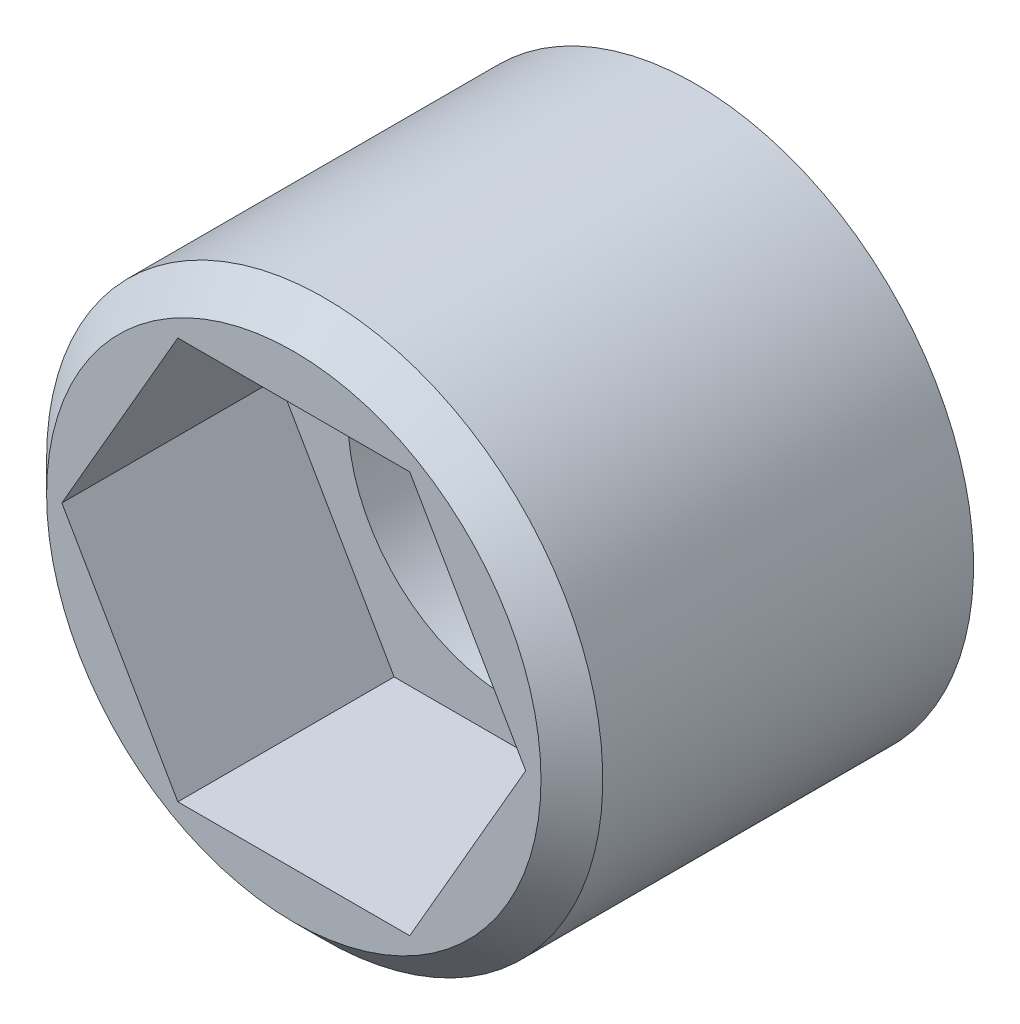
ISO-10303-21;
HEADER;
FILE_DESCRIPTION(('STEP AP214'),'2;1');
FILE_NAME('part.step','',(''),(''),'','','');
FILE_SCHEMA(('AUTOMOTIVE_DESIGN { 1 0 10303 214 1 1 1 1 }'));
ENDSEC;
DATA;
#1=APPLICATION_CONTEXT('core data for automotive mechanical design processes');
#2=APPLICATION_PROTOCOL_DEFINITION('international standard','automotive_design',2000,#1);
#3=PRODUCT_CONTEXT('',#1,'mechanical');
#4=PRODUCT('Part','Part','',(#3));
#5=PRODUCT_RELATED_PRODUCT_CATEGORY('part','',(#4));
#6=PRODUCT_DEFINITION_FORMATION('','',#4);
#7=PRODUCT_DEFINITION_CONTEXT('part definition',#1,'design');
#8=PRODUCT_DEFINITION('design','',#6,#7);
#9=PRODUCT_DEFINITION_SHAPE('','',#8);
#10=(LENGTH_UNIT() NAMED_UNIT(*) SI_UNIT(.MILLI.,.METRE.));
#11=(NAMED_UNIT(*) PLANE_ANGLE_UNIT() SI_UNIT($,.RADIAN.));
#12=(NAMED_UNIT(*) SI_UNIT($,.STERADIAN.) SOLID_ANGLE_UNIT());
#13=UNCERTAINTY_MEASURE_WITH_UNIT(LENGTH_MEASURE(1.E-05),#10,'distance_accuracy_value','');
#14=(GEOMETRIC_REPRESENTATION_CONTEXT(3) GLOBAL_UNCERTAINTY_ASSIGNED_CONTEXT((#13)) GLOBAL_UNIT_ASSIGNED_CONTEXT((#10,
#11,#12)) REPRESENTATION_CONTEXT('',''));
#15=CARTESIAN_POINT('',(0.,0.,0.));
#16=DIRECTION('',(0.,0.,1.));
#17=DIRECTION('',(1.,0.,0.));
#18=AXIS2_PLACEMENT_3D('',#15,#16,#17);
#19=CARTESIAN_POINT('',(0.,0.,13.));
#20=DIRECTION('',(0.,0.,-1.));
#21=DIRECTION('',(-1.,0.,0.));
#22=AXIS2_PLACEMENT_3D('',#19,#20,#21);
#23=CYLINDRICAL_SURFACE('',#22,5.25);
#24=CARTESIAN_POINT('',(0.,0.,0.));
#25=DIRECTION('',(0.,0.,1.));
#26=DIRECTION('',(1.,0.,0.));
#27=AXIS2_PLACEMENT_3D('',#24,#25,#26);
#28=CIRCLE('',#27,5.25);
#29=CARTESIAN_POINT('',(-5.25,0.,0.));
#30=VERTEX_POINT('',#29);
#31=EDGE_CURVE('E140',#30,#30,#28,.T.);
#32=CARTESIAN_POINT('',(0.,0.,6.));
#33=DIRECTION('',(0.,0.,1.));
#34=DIRECTION('',(1.,0.,0.));
#35=AXIS2_PLACEMENT_3D('',#32,#33,#34);
#36=CIRCLE('',#35,5.25);
#37=CARTESIAN_POINT('',(-5.25,0.,6.));
#38=VERTEX_POINT('',#37);
#39=EDGE_CURVE('E134',#38,#38,#36,.T.);
#40=CARTESIAN_POINT('',(-5.25,0.,0.));
#41=CARTESIAN_POINT('',(-5.25,0.,0.0625000000000001));
#42=CARTESIAN_POINT('',(-5.25,0.,0.125));
#43=CARTESIAN_POINT('',(-5.25,0.,0.25));
#44=CARTESIAN_POINT('',(-5.25,0.,0.3125));
#45=CARTESIAN_POINT('',(-5.25,0.,0.4375));
#46=CARTESIAN_POINT('',(-5.25,0.,0.5));
#47=CARTESIAN_POINT('',(-5.25,0.,0.625000000000001));
#48=CARTESIAN_POINT('',(-5.25,0.,0.687500000000001));
#49=CARTESIAN_POINT('',(-5.25,0.,0.812500000000001));
#50=CARTESIAN_POINT('',(-5.25,0.,0.875000000000001));
#51=CARTESIAN_POINT('',(-5.25,0.,1.));
#52=CARTESIAN_POINT('',(-5.25,0.,1.0625));
#53=CARTESIAN_POINT('',(-5.25,0.,1.1875));
#54=CARTESIAN_POINT('',(-5.25,0.,1.25));
#55=CARTESIAN_POINT('',(-5.25,0.,1.375));
#56=CARTESIAN_POINT('',(-5.25,0.,1.4375));
#57=CARTESIAN_POINT('',(-5.25,0.,1.5625));
#58=CARTESIAN_POINT('',(-5.25,0.,1.625));
#59=CARTESIAN_POINT('',(-5.25,0.,1.75));
#60=CARTESIAN_POINT('',(-5.25,0.,1.8125));
#61=CARTESIAN_POINT('',(-5.25,0.,1.9375));
#62=CARTESIAN_POINT('',(-5.25,0.,2.));
#63=CARTESIAN_POINT('',(-5.25,0.,2.125));
#64=CARTESIAN_POINT('',(-5.25,0.,2.1875));
#65=CARTESIAN_POINT('',(-5.25,0.,2.3125));
#66=CARTESIAN_POINT('',(-5.25,0.,2.375));
#67=CARTESIAN_POINT('',(-5.25,0.,2.5));
#68=CARTESIAN_POINT('',(-5.25,0.,2.5625));
#69=CARTESIAN_POINT('',(-5.25,0.,2.6875));
#70=CARTESIAN_POINT('',(-5.25,0.,2.75));
#71=CARTESIAN_POINT('',(-5.25,0.,2.875));
#72=CARTESIAN_POINT('',(-5.25,0.,2.9375));
#73=CARTESIAN_POINT('',(-5.25,0.,3.0625));
#74=CARTESIAN_POINT('',(-5.25,0.,3.125));
#75=CARTESIAN_POINT('',(-5.25,0.,3.25));
#76=CARTESIAN_POINT('',(-5.25,0.,3.3125));
#77=CARTESIAN_POINT('',(-5.25,0.,3.4375));
#78=CARTESIAN_POINT('',(-5.25,0.,3.5));
#79=CARTESIAN_POINT('',(-5.25,0.,3.625));
#80=CARTESIAN_POINT('',(-5.25,0.,3.6875));
#81=CARTESIAN_POINT('',(-5.25,0.,3.8125));
#82=CARTESIAN_POINT('',(-5.25,0.,3.875));
#83=CARTESIAN_POINT('',(-5.25,0.,4.));
#84=CARTESIAN_POINT('',(-5.25,0.,4.0625));
#85=CARTESIAN_POINT('',(-5.25,0.,4.1875));
#86=CARTESIAN_POINT('',(-5.25,0.,4.25));
#87=CARTESIAN_POINT('',(-5.25,0.,4.375));
#88=CARTESIAN_POINT('',(-5.25,0.,4.4375));
#89=CARTESIAN_POINT('',(-5.25,0.,4.5625));
#90=CARTESIAN_POINT('',(-5.25,0.,4.625));
#91=CARTESIAN_POINT('',(-5.25,0.,4.75));
#92=CARTESIAN_POINT('',(-5.25,0.,4.8125));
#93=CARTESIAN_POINT('',(-5.25,0.,4.9375));
#94=CARTESIAN_POINT('',(-5.25,0.,5.));
#95=CARTESIAN_POINT('',(-5.25,0.,5.125));
#96=CARTESIAN_POINT('',(-5.25,0.,5.1875));
#97=CARTESIAN_POINT('',(-5.25,0.,5.3125));
#98=CARTESIAN_POINT('',(-5.25,0.,5.375));
#99=CARTESIAN_POINT('',(-5.25,0.,5.5));
#100=CARTESIAN_POINT('',(-5.25,0.,5.5625));
#101=CARTESIAN_POINT('',(-5.25,0.,5.6875));
#102=CARTESIAN_POINT('',(-5.25,0.,5.75));
#103=CARTESIAN_POINT('',(-5.25,0.,5.875));
#104=CARTESIAN_POINT('',(-5.25,0.,5.9375));
#105=CARTESIAN_POINT('',(-5.25,0.,6.));
#106=B_SPLINE_CURVE_WITH_KNOTS('',3,(#40,#41,#42,#43,#44,#45,#46,#47,#48,#49,#50,#51,#52,#53,
#54,#55,#56,#57,#58,#59,#60,#61,#62,#63,#64,#65,#66,#67,#68,#69,#70,#71,#72,#73,#74,#75,#76,#77,
#78,#79,#80,#81,#82,#83,#84,#85,#86,#87,#88,#89,#90,#91,#92,#93,#94,#95,#96,#97,#98,#99,#100,
#101,#102,#103,#104,#105),.UNSPECIFIED.,.F.,.F.,(4,2,2,2,2,2,2,2,2,2,2,2,2,2,2,2,2,2,2,2,2,2,2,
2,2,2,2,2,2,2,2,2,4),(0.,0.1875,0.375,0.5625,0.750000000000001,0.937500000000001,1.125,1.3125,
1.5,1.6875,1.875,2.0625,2.25,2.4375,2.625,2.8125,3.,3.1875,3.375,3.5625,3.75,3.9375,4.125,
4.3125,4.5,4.6875,4.875,5.0625,5.25,5.4375,5.625,5.8125,6.),.UNSPECIFIED.);
#107=EDGE_CURVE('BSEAM32',#30,#38,#106,.T.);
#108=ORIENTED_EDGE('',*,*,#31,.F.);
#109=ORIENTED_EDGE('',*,*,#39,.T.);
#110=ORIENTED_EDGE('',*,*,#107,.T.);
#111=ORIENTED_EDGE('',*,*,#107,.F.);
#112=EDGE_LOOP('',(#108,#110,#109,#111));
#113=FACE_BOUND('',#112,.T.);
#114=ADVANCED_FACE('F32',(#113),#23,.F.);
#115=CARTESIAN_POINT('',(0.,0.,13.));
#116=DIRECTION('',(0.,0.,1.));
#117=DIRECTION('',(1.,0.,0.));
#118=AXIS2_PLACEMENT_3D('',#115,#116,#117);
#119=PLANE('',#118);
#120=CARTESIAN_POINT('',(0.,0.,13.));
#121=DIRECTION('',(0.,0.,1.));
#122=DIRECTION('',(1.,0.,0.));
#123=AXIS2_PLACEMENT_3D('',#120,#121,#122);
#124=CIRCLE('',#123,8.00000000000002);
#125=CARTESIAN_POINT('',(8.00000000000002,0.,13.));
#126=VERTEX_POINT('',#125);
#127=EDGE_CURVE('E40',#126,#126,#124,.T.);
#128=ORIENTED_EDGE('',*,*,#127,.T.);
#129=EDGE_LOOP('',(#128));
#130=FACE_BOUND('',#129,.T.);
#131=DIRECTION('',(-0.5,0.866025403784438,0.));
#132=VECTOR('',#131,1.);
#133=CARTESIAN_POINT('',(7.50555349946514,0.,13.));
#134=LINE('',#133,#132);
#135=CARTESIAN_POINT('',(7.50555349946514,0.,13.));
#136=VERTEX_POINT('',#135);
#137=CARTESIAN_POINT('',(3.75277674973257,6.5,13.));
#138=VERTEX_POINT('',#137);
#139=EDGE_CURVE('E47',#136,#138,#134,.T.);
#140=ORIENTED_EDGE('',*,*,#139,.F.);
#141=DIRECTION('',(0.5,0.866025403784439,0.));
#142=VECTOR('',#141,1.);
#143=CARTESIAN_POINT('',(3.75277674973257,-6.5,13.));
#144=LINE('',#143,#142);
#145=CARTESIAN_POINT('',(3.75277674973257,-6.5,13.));
#146=VERTEX_POINT('',#145);
#147=EDGE_CURVE('E130',#146,#136,#144,.T.);
#148=ORIENTED_EDGE('',*,*,#147,.F.);
#149=DIRECTION('',(1.,0.,0.));
#150=VECTOR('',#149,1.);
#151=CARTESIAN_POINT('',(-3.75277674973257,-6.5,13.));
#152=LINE('',#151,#150);
#153=CARTESIAN_POINT('',(-3.75277674973257,-6.5,13.));
#154=VERTEX_POINT('',#153);
#155=EDGE_CURVE('E128',#154,#146,#152,.T.);
#156=ORIENTED_EDGE('',*,*,#155,.F.);
#157=DIRECTION('',(0.5,-0.866025403784439,0.));
#158=VECTOR('',#157,1.);
#159=CARTESIAN_POINT('',(-7.50555349946514,0.,13.));
#160=LINE('',#159,#158);
#161=CARTESIAN_POINT('',(-7.50555349946514,0.,13.));
#162=VERTEX_POINT('',#161);
#163=EDGE_CURVE('E95',#162,#154,#160,.T.);
#164=ORIENTED_EDGE('',*,*,#163,.F.);
#165=DIRECTION('',(-0.5,-0.866025403784439,0.));
#166=VECTOR('',#165,1.);
#167=CARTESIAN_POINT('',(-3.75277674973257,6.5,13.));
#168=LINE('',#167,#166);
#169=CARTESIAN_POINT('',(-3.75277674973257,6.5,13.));
#170=VERTEX_POINT('',#169);
#171=EDGE_CURVE('E124',#170,#162,#168,.T.);
#172=ORIENTED_EDGE('',*,*,#171,.F.);
#173=DIRECTION('',(-1.,0.,0.));
#174=VECTOR('',#173,1.);
#175=CARTESIAN_POINT('',(3.75277674973257,6.5,13.));
#176=LINE('',#175,#174);
#177=EDGE_CURVE('E121',#138,#170,#176,.T.);
#178=ORIENTED_EDGE('',*,*,#177,.F.);
#179=EDGE_LOOP('',(#140,#148,#156,#164,#172,#178));
#180=FACE_BOUND('',#179,.T.);
#181=ADVANCED_FACE('F150',(#130,#180),#119,.T.);
#182=CARTESIAN_POINT('',(0.,0.,0.));
#183=DIRECTION('',(0.,0.,1.));
#184=DIRECTION('',(1.,0.,0.));
#185=AXIS2_PLACEMENT_3D('',#182,#183,#184);
#186=PLANE('',#185);
#187=CARTESIAN_POINT('',(0.,0.,0.));
#188=DIRECTION('',(0.,0.,1.));
#189=DIRECTION('',(1.,0.,0.));
#190=AXIS2_PLACEMENT_3D('',#187,#188,#189);
#191=CIRCLE('',#190,9.);
#192=CARTESIAN_POINT('',(-9.,0.,0.));
#193=VERTEX_POINT('',#192);
#194=EDGE_CURVE('E143',#193,#193,#191,.T.);
#195=ORIENTED_EDGE('',*,*,#194,.F.);
#196=EDGE_LOOP('',(#195));
#197=FACE_BOUND('',#196,.T.);
#198=ORIENTED_EDGE('',*,*,#31,.T.);
#199=EDGE_LOOP('',(#198));
#200=FACE_BOUND('',#199,.T.);
#201=ADVANCED_FACE('F168',(#197,#200),#186,.F.);
#202=CARTESIAN_POINT('',(0.,0.,13.));
#203=DIRECTION('',(0.,0.,-1.));
#204=DIRECTION('',(-1.,0.,0.));
#205=AXIS2_PLACEMENT_3D('',#202,#203,#204);
#206=CYLINDRICAL_SURFACE('',#205,9.);
#207=CARTESIAN_POINT('',(0.,0.,12.));
#208=DIRECTION('',(0.,0.,1.));
#209=DIRECTION('',(1.,0.,0.));
#210=AXIS2_PLACEMENT_3D('',#207,#208,#209);
#211=CIRCLE('',#210,9.);
#212=CARTESIAN_POINT('',(-9.,0.,12.));
#213=VERTEX_POINT('',#212);
#214=EDGE_CURVE('E11',#213,#213,#211,.F.);
#215=CARTESIAN_POINT('',(-9.,0.,12.));
#216=CARTESIAN_POINT('',(-9.,0.,11.875));
#217=CARTESIAN_POINT('',(-9.,0.,11.75));
#218=CARTESIAN_POINT('',(-9.,0.,11.5));
#219=CARTESIAN_POINT('',(-9.,0.,11.375));
#220=CARTESIAN_POINT('',(-9.,0.,11.125));
#221=CARTESIAN_POINT('',(-9.,0.,11.));
#222=CARTESIAN_POINT('',(-9.,0.,10.75));
#223=CARTESIAN_POINT('',(-9.,0.,10.625));
#224=CARTESIAN_POINT('',(-9.,0.,10.375));
#225=CARTESIAN_POINT('',(-9.,0.,10.25));
#226=CARTESIAN_POINT('',(-9.,0.,10.));
#227=CARTESIAN_POINT('',(-9.,0.,9.87500000000001));
#228=CARTESIAN_POINT('',(-9.,0.,9.62500000000001));
#229=CARTESIAN_POINT('',(-9.,0.,9.50000000000001));
#230=CARTESIAN_POINT('',(-9.,0.,9.25000000000001));
#231=CARTESIAN_POINT('',(-9.,0.,9.12500000000001));
#232=CARTESIAN_POINT('',(-9.,0.,8.87500000000001));
#233=CARTESIAN_POINT('',(-9.,0.,8.75000000000001));
#234=CARTESIAN_POINT('',(-9.,0.,8.50000000000001));
#235=CARTESIAN_POINT('',(-9.,0.,8.37500000000001));
#236=CARTESIAN_POINT('',(-9.,0.,8.12500000000001));
#237=CARTESIAN_POINT('',(-9.,0.,8.00000000000001));
#238=CARTESIAN_POINT('',(-9.,0.,7.75000000000001));
#239=CARTESIAN_POINT('',(-9.,0.,7.62500000000001));
#240=CARTESIAN_POINT('',(-9.,0.,7.37500000000001));
#241=CARTESIAN_POINT('',(-9.,0.,7.25000000000001));
#242=CARTESIAN_POINT('',(-9.,0.,7.00000000000001));
#243=CARTESIAN_POINT('',(-9.,0.,6.87500000000001));
#244=CARTESIAN_POINT('',(-9.,0.,6.62500000000001));
#245=CARTESIAN_POINT('',(-9.,0.,6.50000000000001));
#246=CARTESIAN_POINT('',(-9.,0.,6.25000000000001));
#247=CARTESIAN_POINT('',(-9.,0.,6.12500000000001));
#248=CARTESIAN_POINT('',(-9.,0.,5.87500000000001));
#249=CARTESIAN_POINT('',(-9.,0.,5.75000000000001));
#250=CARTESIAN_POINT('',(-9.,0.,5.50000000000001));
#251=CARTESIAN_POINT('',(-9.,0.,5.37500000000001));
#252=CARTESIAN_POINT('',(-9.,0.,5.12500000000001));
#253=CARTESIAN_POINT('',(-9.,0.,5.00000000000001));
#254=CARTESIAN_POINT('',(-9.,0.,4.75000000000001));
#255=CARTESIAN_POINT('',(-9.,0.,4.62500000000001));
#256=CARTESIAN_POINT('',(-9.,0.,4.375));
#257=CARTESIAN_POINT('',(-9.,0.,4.25));
#258=CARTESIAN_POINT('',(-9.,0.,4.));
#259=CARTESIAN_POINT('',(-9.,0.,3.875));
#260=CARTESIAN_POINT('',(-9.,0.,3.625));
#261=CARTESIAN_POINT('',(-9.,0.,3.5));
#262=CARTESIAN_POINT('',(-9.,0.,3.25));
#263=CARTESIAN_POINT('',(-9.,0.,3.125));
#264=CARTESIAN_POINT('',(-9.,0.,2.875));
#265=CARTESIAN_POINT('',(-9.,0.,2.75));
#266=CARTESIAN_POINT('',(-9.,0.,2.5));
#267=CARTESIAN_POINT('',(-9.,0.,2.375));
#268=CARTESIAN_POINT('',(-9.,0.,2.125));
#269=CARTESIAN_POINT('',(-9.,0.,2.));
#270=CARTESIAN_POINT('',(-9.,0.,1.75));
#271=CARTESIAN_POINT('',(-9.,0.,1.625));
#272=CARTESIAN_POINT('',(-9.,0.,1.375));
#273=CARTESIAN_POINT('',(-9.,0.,1.25));
#274=CARTESIAN_POINT('',(-9.,0.,1.));
#275=CARTESIAN_POINT('',(-9.,0.,0.875000000000001));
#276=CARTESIAN_POINT('',(-9.,0.,0.625000000000001));
#277=CARTESIAN_POINT('',(-9.,0.,0.5));
#278=CARTESIAN_POINT('',(-9.,0.,0.25));
#279=CARTESIAN_POINT('',(-9.,0.,0.125));
#280=CARTESIAN_POINT('',(-9.,0.,0.));
#281=B_SPLINE_CURVE_WITH_KNOTS('',3,(#215,#216,#217,#218,#219,#220,#221,#222,#223,#224,#225,
#226,#227,#228,#229,#230,#231,#232,#233,#234,#235,#236,#237,#238,#239,#240,#241,#242,#243,#244,
#245,#246,#247,#248,#249,#250,#251,#252,#253,#254,#255,#256,#257,#258,#259,#260,#261,#262,#263,
#264,#265,#266,#267,#268,#269,#270,#271,#272,#273,#274,#275,#276,#277,#278,#279,#280),
.UNSPECIFIED.,.F.,.F.,(4,2,2,2,2,2,2,2,2,2,2,2,2,2,2,2,2,2,2,2,2,2,2,2,2,2,2,2,2,2,2,2,4),(0.,
0.375000000000002,0.750000000000002,1.125,1.5,1.875,2.25,2.625,3.,3.375,3.75,4.12500000000001,
4.50000000000001,4.87500000000001,5.25000000000001,5.62500000000001,6.00000000000001,
6.37500000000001,6.75000000000001,7.12500000000001,7.50000000000001,7.87500000000001,
8.25000000000001,8.62500000000001,9.00000000000001,9.37500000000001,9.75000000000001,10.125,
10.5,10.875,11.25,11.625,12.),.UNSPECIFIED.);
#282=EDGE_CURVE('BSEAM177',#213,#193,#281,.T.);
#283=ORIENTED_EDGE('',*,*,#214,.T.);
#284=ORIENTED_EDGE('',*,*,#194,.T.);
#285=ORIENTED_EDGE('',*,*,#282,.T.);
#286=ORIENTED_EDGE('',*,*,#282,.F.);
#287=EDGE_LOOP('',(#283,#285,#284,#286));
#288=FACE_BOUND('',#287,.T.);
#289=ADVANCED_FACE('F177',(#288),#206,.T.);
#290=CARTESIAN_POINT('',(7.50555349946514,0.,6.));
#291=DIRECTION('',(0.866025403784438,0.5,0.));
#292=DIRECTION('',(-0.5,0.866025403784438,0.));
#293=AXIS2_PLACEMENT_3D('',#290,#291,#292);
#294=PLANE('',#293);
#295=ORIENTED_EDGE('',*,*,#139,.T.);
#296=DIRECTION('',(0.,0.,1.));
#297=VECTOR('',#296,1.);
#298=CARTESIAN_POINT('',(3.75277674973257,6.5,6.));
#299=LINE('',#298,#297);
#300=CARTESIAN_POINT('',(3.75277674973257,6.5,6.));
#301=VERTEX_POINT('',#300);
#302=EDGE_CURVE('E77',#301,#138,#299,.T.);
#303=ORIENTED_EDGE('',*,*,#302,.F.);
#304=DIRECTION('',(-0.5,0.866025403784438,0.));
#305=VECTOR('',#304,1.);
#306=CARTESIAN_POINT('',(7.50555349946514,0.,6.));
#307=LINE('',#306,#305);
#308=CARTESIAN_POINT('',(7.50555349946514,0.,6.));
#309=VERTEX_POINT('',#308);
#310=EDGE_CURVE('E132',#309,#301,#307,.T.);
#311=ORIENTED_EDGE('',*,*,#310,.F.);
#312=DIRECTION('',(0.,0.,1.));
#313=VECTOR('',#312,1.);
#314=CARTESIAN_POINT('',(7.50555349946514,0.,6.));
#315=LINE('',#314,#313);
#316=EDGE_CURVE('E55',#309,#136,#315,.T.);
#317=ORIENTED_EDGE('',*,*,#316,.T.);
#318=EDGE_LOOP('',(#295,#303,#311,#317));
#319=FACE_BOUND('',#318,.T.);
#320=ADVANCED_FACE('F173',(#319),#294,.F.);
#321=CARTESIAN_POINT('',(3.75277674973257,-6.5,6.));
#322=DIRECTION('',(0.866025403784438,-0.5,0.));
#323=DIRECTION('',(0.5,0.866025403784439,0.));
#324=AXIS2_PLACEMENT_3D('',#321,#322,#323);
#325=PLANE('',#324);
#326=ORIENTED_EDGE('',*,*,#147,.T.);
#327=ORIENTED_EDGE('',*,*,#316,.F.);
#328=DIRECTION('',(0.5,0.866025403784439,0.));
#329=VECTOR('',#328,1.);
#330=CARTESIAN_POINT('',(3.75277674973257,-6.5,6.));
#331=LINE('',#330,#329);
#332=CARTESIAN_POINT('',(3.75277674973257,-6.5,6.));
#333=VERTEX_POINT('',#332);
#334=EDGE_CURVE('E107',#333,#309,#331,.T.);
#335=ORIENTED_EDGE('',*,*,#334,.F.);
#336=DIRECTION('',(0.,0.,1.));
#337=VECTOR('',#336,1.);
#338=CARTESIAN_POINT('',(3.75277674973257,-6.5,6.));
#339=LINE('',#338,#337);
#340=EDGE_CURVE('E99',#333,#146,#339,.T.);
#341=ORIENTED_EDGE('',*,*,#340,.T.);
#342=EDGE_LOOP('',(#326,#327,#335,#341));
#343=FACE_BOUND('',#342,.T.);
#344=ADVANCED_FACE('F184',(#343),#325,.F.);
#345=CARTESIAN_POINT('',(-3.75277674973257,-6.5,6.));
#346=DIRECTION('',(0.,-1.,0.));
#347=DIRECTION('',(0.,0.,-1.));
#348=AXIS2_PLACEMENT_3D('',#345,#346,#347);
#349=PLANE('',#348);
#350=ORIENTED_EDGE('',*,*,#155,.T.);
#351=ORIENTED_EDGE('',*,*,#340,.F.);
#352=DIRECTION('',(1.,0.,0.));
#353=VECTOR('',#352,1.);
#354=CARTESIAN_POINT('',(-3.75277674973257,-6.5,6.));
#355=LINE('',#354,#353);
#356=CARTESIAN_POINT('',(-3.75277674973257,-6.5,6.));
#357=VERTEX_POINT('',#356);
#358=EDGE_CURVE('E103',#357,#333,#355,.T.);
#359=ORIENTED_EDGE('',*,*,#358,.F.);
#360=DIRECTION('',(0.,0.,1.));
#361=VECTOR('',#360,1.);
#362=CARTESIAN_POINT('',(-3.75277674973257,-6.5,6.));
#363=LINE('',#362,#361);
#364=EDGE_CURVE('E88',#357,#154,#363,.T.);
#365=ORIENTED_EDGE('',*,*,#364,.T.);
#366=EDGE_LOOP('',(#350,#351,#359,#365));
#367=FACE_BOUND('',#366,.T.);
#368=ADVANCED_FACE('F104',(#367),#349,.F.);
#369=CARTESIAN_POINT('',(-7.50555349946514,0.,6.));
#370=DIRECTION('',(-0.866025403784438,-0.5,0.));
#371=DIRECTION('',(0.5,-0.866025403784439,0.));
#372=AXIS2_PLACEMENT_3D('',#369,#370,#371);
#373=PLANE('',#372);
#374=ORIENTED_EDGE('',*,*,#163,.T.);
#375=ORIENTED_EDGE('',*,*,#364,.F.);
#376=DIRECTION('',(0.5,-0.866025403784439,0.));
#377=VECTOR('',#376,1.);
#378=CARTESIAN_POINT('',(-7.50555349946514,0.,6.));
#379=LINE('',#378,#377);
#380=CARTESIAN_POINT('',(-7.50555349946514,0.,6.));
#381=VERTEX_POINT('',#380);
#382=EDGE_CURVE('E92',#381,#357,#379,.T.);
#383=ORIENTED_EDGE('',*,*,#382,.F.);
#384=DIRECTION('',(0.,0.,1.));
#385=VECTOR('',#384,1.);
#386=CARTESIAN_POINT('',(-7.50555349946514,0.,6.));
#387=LINE('',#386,#385);
#388=EDGE_CURVE('E100',#381,#162,#387,.T.);
#389=ORIENTED_EDGE('',*,*,#388,.T.);
#390=EDGE_LOOP('',(#374,#375,#383,#389));
#391=FACE_BOUND('',#390,.T.);
#392=ADVANCED_FACE('F90',(#391),#373,.F.);
#393=CARTESIAN_POINT('',(-3.75277674973257,6.5,6.));
#394=DIRECTION('',(-0.866025403784439,0.5,0.));
#395=DIRECTION('',(-0.5,-0.866025403784439,0.));
#396=AXIS2_PLACEMENT_3D('',#393,#394,#395);
#397=PLANE('',#396);
#398=ORIENTED_EDGE('',*,*,#171,.T.);
#399=ORIENTED_EDGE('',*,*,#388,.F.);
#400=DIRECTION('',(-0.5,-0.866025403784439,0.));
#401=VECTOR('',#400,1.);
#402=CARTESIAN_POINT('',(-3.75277674973257,6.5,6.));
#403=LINE('',#402,#401);
#404=CARTESIAN_POINT('',(-3.75277674973257,6.5,6.));
#405=VERTEX_POINT('',#404);
#406=EDGE_CURVE('E113',#405,#381,#403,.T.);
#407=ORIENTED_EDGE('',*,*,#406,.F.);
#408=DIRECTION('',(0.,0.,1.));
#409=VECTOR('',#408,1.);
#410=CARTESIAN_POINT('',(-3.75277674973257,6.5,6.));
#411=LINE('',#410,#409);
#412=EDGE_CURVE('E137',#405,#170,#411,.T.);
#413=ORIENTED_EDGE('',*,*,#412,.T.);
#414=EDGE_LOOP('',(#398,#399,#407,#413));
#415=FACE_BOUND('',#414,.T.);
#416=ADVANCED_FACE('F199',(#415),#397,.F.);
#417=CARTESIAN_POINT('',(3.75277674973257,6.5,6.));
#418=DIRECTION('',(0.,1.,0.));
#419=DIRECTION('',(0.,0.,1.));
#420=AXIS2_PLACEMENT_3D('',#417,#418,#419);
#421=PLANE('',#420);
#422=ORIENTED_EDGE('',*,*,#177,.T.);
#423=ORIENTED_EDGE('',*,*,#412,.F.);
#424=DIRECTION('',(-1.,0.,0.));
#425=VECTOR('',#424,1.);
#426=CARTESIAN_POINT('',(3.75277674973257,6.5,6.));
#427=LINE('',#426,#425);
#428=EDGE_CURVE('E115',#301,#405,#427,.T.);
#429=ORIENTED_EDGE('',*,*,#428,.F.);
#430=ORIENTED_EDGE('',*,*,#302,.T.);
#431=EDGE_LOOP('',(#422,#423,#429,#430));
#432=FACE_BOUND('',#431,.T.);
#433=ADVANCED_FACE('F158',(#432),#421,.F.);
#434=CARTESIAN_POINT('',(0.,0.,6.));
#435=DIRECTION('',(0.,0.,1.));
#436=DIRECTION('',(1.,0.,0.));
#437=AXIS2_PLACEMENT_3D('',#434,#435,#436);
#438=PLANE('',#437);
#439=ORIENTED_EDGE('',*,*,#39,.F.);
#440=EDGE_LOOP('',(#439));
#441=FACE_BOUND('',#440,.T.);
#442=ORIENTED_EDGE('',*,*,#310,.T.);
#443=ORIENTED_EDGE('',*,*,#428,.T.);
#444=ORIENTED_EDGE('',*,*,#406,.T.);
#445=ORIENTED_EDGE('',*,*,#382,.T.);
#446=ORIENTED_EDGE('',*,*,#358,.T.);
#447=ORIENTED_EDGE('',*,*,#334,.T.);
#448=EDGE_LOOP('',(#442,#443,#444,#445,#446,#447));
#449=FACE_BOUND('',#448,.T.);
#450=ADVANCED_FACE('F110',(#441,#449),#438,.T.);
#451=CARTESIAN_POINT('',(0.,0.,13.));
#452=DIRECTION('',(0.,0.,-1.));
#453=DIRECTION('',(-1.,0.,0.));
#454=AXIS2_PLACEMENT_3D('',#451,#452,#453);
#455=CONICAL_SURFACE('',#454,8.00000000000002,0.785398163397447);
#456=ORIENTED_EDGE('',*,*,#214,.F.);
#457=EDGE_LOOP('',(#456));
#458=FACE_BOUND('',#457,.T.);
#459=ORIENTED_EDGE('',*,*,#127,.F.);
#460=EDGE_LOOP('',(#459));
#461=FACE_BOUND('',#460,.T.);
#462=ADVANCED_FACE('F34',(#458,#461),#455,.T.);
#463=CLOSED_SHELL('',(#114,#181,#201,#289,#320,#344,#368,#392,#416,#433,#450,#462));
#464=MANIFOLD_SOLID_BREP('B2',#463);
#465=ADVANCED_BREP_SHAPE_REPRESENTATION('',(#18,#464),#14);
#466=SHAPE_DEFINITION_REPRESENTATION(#9,#465);
ENDSEC;
END-ISO-10303-21;
